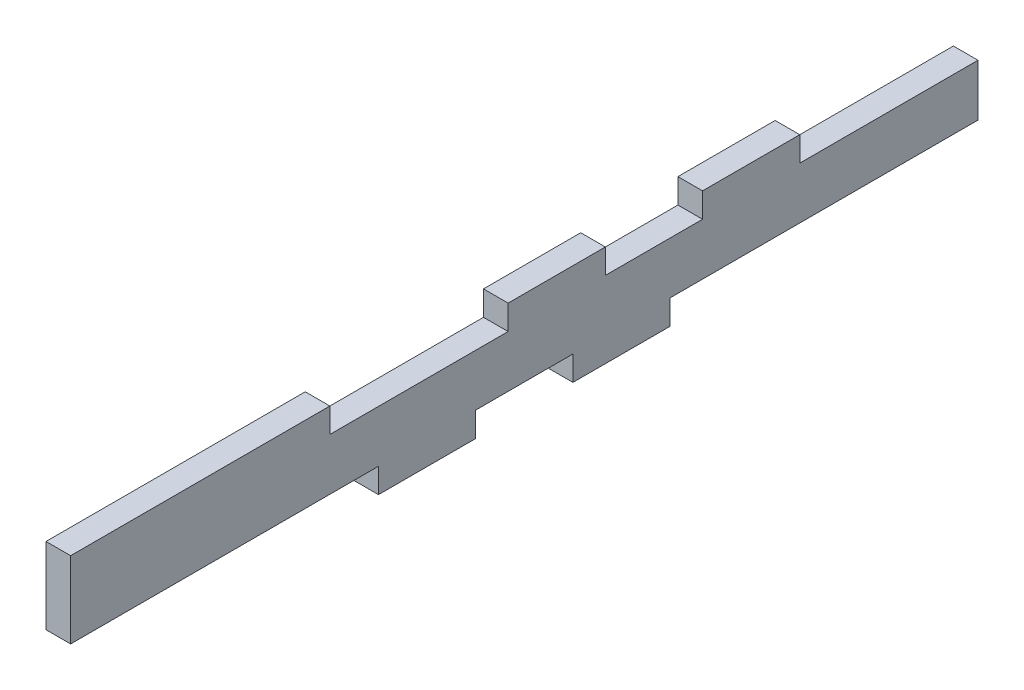
ISO-10303-21;
HEADER;
FILE_DESCRIPTION(('STEP AP214'),'2;1');
FILE_NAME('part.step','',(''),(''),'','','');
FILE_SCHEMA(('AUTOMOTIVE_DESIGN { 1 0 10303 214 1 1 1 1 }'));
ENDSEC;
DATA;
#1=APPLICATION_CONTEXT('core data for automotive mechanical design processes');
#2=APPLICATION_PROTOCOL_DEFINITION('international standard','automotive_design',2000,#1);
#3=PRODUCT_CONTEXT('',#1,'mechanical');
#4=PRODUCT('Part','Part','',(#3));
#5=PRODUCT_RELATED_PRODUCT_CATEGORY('part','',(#4));
#6=PRODUCT_DEFINITION_FORMATION('','',#4);
#7=PRODUCT_DEFINITION_CONTEXT('part definition',#1,'design');
#8=PRODUCT_DEFINITION('design','',#6,#7);
#9=PRODUCT_DEFINITION_SHAPE('','',#8);
#10=(LENGTH_UNIT() NAMED_UNIT(*) SI_UNIT(.MILLI.,.METRE.));
#11=(NAMED_UNIT(*) PLANE_ANGLE_UNIT() SI_UNIT($,.RADIAN.));
#12=(NAMED_UNIT(*) SI_UNIT($,.STERADIAN.) SOLID_ANGLE_UNIT());
#13=UNCERTAINTY_MEASURE_WITH_UNIT(LENGTH_MEASURE(1.E-05),#10,'distance_accuracy_value','');
#14=(GEOMETRIC_REPRESENTATION_CONTEXT(3) GLOBAL_UNCERTAINTY_ASSIGNED_CONTEXT((#13)) GLOBAL_UNIT_ASSIGNED_CONTEXT((#10,
#11,#12)) REPRESENTATION_CONTEXT('',''));
#15=CARTESIAN_POINT('',(0.,0.,0.));
#16=DIRECTION('',(0.,0.,1.));
#17=DIRECTION('',(1.,0.,0.));
#18=AXIS2_PLACEMENT_3D('',#15,#16,#17);
#19=CARTESIAN_POINT('',(4.826,0.,0.));
#20=DIRECTION('',(0.,1.,0.));
#21=DIRECTION('',(0.,0.,1.));
#22=AXIS2_PLACEMENT_3D('',#19,#20,#21);
#23=PLANE('',#22);
#24=DIRECTION('',(0.,0.,-1.));
#25=VECTOR('',#24,1.);
#26=CARTESIAN_POINT('',(4.826,0.,0.));
#27=LINE('',#26,#25);
#28=CARTESIAN_POINT('',(4.826,0.,-98.425));
#29=VERTEX_POINT('',#28);
#30=CARTESIAN_POINT('',(4.826,0.,-117.475));
#31=VERTEX_POINT('',#30);
#32=EDGE_CURVE('E328',#29,#31,#27,.T.);
#33=ORIENTED_EDGE('',*,*,#32,.F.);
#34=DIRECTION('',(1.,0.,0.));
#35=VECTOR('',#34,1.);
#36=CARTESIAN_POINT('',(0.,0.,-98.425));
#37=LINE('',#36,#35);
#38=CARTESIAN_POINT('',(0.,0.,-98.425));
#39=VERTEX_POINT('',#38);
#40=EDGE_CURVE('E210',#39,#29,#37,.T.);
#41=ORIENTED_EDGE('',*,*,#40,.F.);
#42=DIRECTION('',(0.,0.,-1.));
#43=VECTOR('',#42,1.);
#44=CARTESIAN_POINT('',(0.,0.,0.));
#45=LINE('',#44,#43);
#46=CARTESIAN_POINT('',(0.,0.,-117.475));
#47=VERTEX_POINT('',#46);
#48=EDGE_CURVE('E201',#39,#47,#45,.T.);
#49=ORIENTED_EDGE('',*,*,#48,.T.);
#50=DIRECTION('',(1.,0.,0.));
#51=VECTOR('',#50,1.);
#52=CARTESIAN_POINT('',(0.,0.,-117.475));
#53=LINE('',#52,#51);
#54=EDGE_CURVE('E227',#47,#31,#53,.T.);
#55=ORIENTED_EDGE('',*,*,#54,.T.);
#56=EDGE_LOOP('',(#33,#41,#49,#55));
#57=FACE_BOUND('',#56,.T.);
#58=ADVANCED_FACE('F32',(#57),#23,.F.);
#59=CARTESIAN_POINT('',(4.826,19.812,0.));
#60=DIRECTION('',(0.,-1.,0.));
#61=DIRECTION('',(0.,0.,-1.));
#62=AXIS2_PLACEMENT_3D('',#59,#60,#61);
#63=PLANE('',#62);
#64=DIRECTION('',(0.,0.,1.));
#65=VECTOR('',#64,1.);
#66=CARTESIAN_POINT('',(4.826,19.812,0.));
#67=LINE('',#66,#65);
#68=CARTESIAN_POINT('',(4.826,19.812,-104.775));
#69=VERTEX_POINT('',#68);
#70=CARTESIAN_POINT('',(4.826,19.812,-85.725));
#71=VERTEX_POINT('',#70);
#72=EDGE_CURVE('E337',#69,#71,#67,.T.);
#73=ORIENTED_EDGE('',*,*,#72,.F.);
#74=DIRECTION('',(1.,0.,0.));
#75=VECTOR('',#74,1.);
#76=CARTESIAN_POINT('',(0.,19.812,-104.775));
#77=LINE('',#76,#75);
#78=CARTESIAN_POINT('',(0.,19.812,-104.775));
#79=VERTEX_POINT('',#78);
#80=EDGE_CURVE('E289',#79,#69,#77,.T.);
#81=ORIENTED_EDGE('',*,*,#80,.F.);
#82=DIRECTION('',(0.,0.,1.));
#83=VECTOR('',#82,1.);
#84=CARTESIAN_POINT('',(0.,19.812,0.));
#85=LINE('',#84,#83);
#86=CARTESIAN_POINT('',(0.,19.812,-85.725));
#87=VERTEX_POINT('',#86);
#88=EDGE_CURVE('E345',#79,#87,#85,.T.);
#89=ORIENTED_EDGE('',*,*,#88,.T.);
#90=DIRECTION('',(1.,0.,0.));
#91=VECTOR('',#90,1.);
#92=CARTESIAN_POINT('',(0.,19.812,-85.725));
#93=LINE('',#92,#91);
#94=EDGE_CURVE('E319',#87,#71,#93,.T.);
#95=ORIENTED_EDGE('',*,*,#94,.T.);
#96=EDGE_LOOP('',(#73,#81,#89,#95));
#97=FACE_BOUND('',#96,.T.);
#98=ADVANCED_FACE('F383',(#97),#63,.F.);
#99=CARTESIAN_POINT('',(4.826,19.812,-50.8));
#100=VERTEX_POINT('',#99);
#101=CARTESIAN_POINT('',(4.826,19.812,0.));
#102=VERTEX_POINT('',#101);
#103=EDGE_CURVE('E335',#100,#102,#67,.T.);
#104=ORIENTED_EDGE('',*,*,#103,.F.);
#105=DIRECTION('',(1.,0.,0.));
#106=VECTOR('',#105,1.);
#107=CARTESIAN_POINT('',(0.,19.812,-50.8));
#108=LINE('',#107,#106);
#109=CARTESIAN_POINT('',(0.,19.812,-50.8));
#110=VERTEX_POINT('',#109);
#111=EDGE_CURVE('E316',#110,#100,#108,.T.);
#112=ORIENTED_EDGE('',*,*,#111,.F.);
#113=CARTESIAN_POINT('',(0.,19.812,0.));
#114=VERTEX_POINT('',#113);
#115=EDGE_CURVE('E344',#110,#114,#85,.T.);
#116=ORIENTED_EDGE('',*,*,#115,.T.);
#117=DIRECTION('',(-1.,0.,0.));
#118=VECTOR('',#117,1.);
#119=CARTESIAN_POINT('',(4.826,19.812,0.));
#120=LINE('',#119,#118);
#121=EDGE_CURVE('E11',#102,#114,#120,.T.);
#122=ORIENTED_EDGE('',*,*,#121,.F.);
#123=EDGE_LOOP('',(#104,#112,#116,#122));
#124=FACE_BOUND('',#123,.T.);
#125=ADVANCED_FACE('F355',(#124),#63,.F.);
#126=CARTESIAN_POINT('',(4.826,0.,0.));
#127=DIRECTION('',(0.,0.,-1.));
#128=DIRECTION('',(-1.,0.,0.));
#129=AXIS2_PLACEMENT_3D('',#126,#127,#128);
#130=PLANE('',#129);
#131=DIRECTION('',(0.,-1.,0.));
#132=VECTOR('',#131,1.);
#133=CARTESIAN_POINT('',(0.,0.,0.));
#134=LINE('',#133,#132);
#135=CARTESIAN_POINT('',(0.,4.826,0.));
#136=VERTEX_POINT('',#135);
#137=EDGE_CURVE('E318',#114,#136,#134,.T.);
#138=ORIENTED_EDGE('',*,*,#137,.T.);
#139=DIRECTION('',(1.,0.,0.));
#140=VECTOR('',#139,1.);
#141=CARTESIAN_POINT('',(0.,4.826,0.));
#142=LINE('',#141,#140);
#143=CARTESIAN_POINT('',(4.826,4.826,0.));
#144=VERTEX_POINT('',#143);
#145=EDGE_CURVE('E245',#136,#144,#142,.T.);
#146=ORIENTED_EDGE('',*,*,#145,.T.);
#147=DIRECTION('',(0.,-1.,0.));
#148=VECTOR('',#147,1.);
#149=CARTESIAN_POINT('',(4.826,0.,0.));
#150=LINE('',#149,#148);
#151=EDGE_CURVE('E325',#102,#144,#150,.T.);
#152=ORIENTED_EDGE('',*,*,#151,.F.);
#153=ORIENTED_EDGE('',*,*,#121,.T.);
#154=EDGE_LOOP('',(#138,#146,#152,#153));
#155=FACE_BOUND('',#154,.T.);
#156=ADVANCED_FACE('F34',(#155),#130,.F.);
#157=CARTESIAN_POINT('',(0.,0.,-60.325));
#158=VERTEX_POINT('',#157);
#159=CARTESIAN_POINT('',(0.,0.,-79.375));
#160=VERTEX_POINT('',#159);
#161=EDGE_CURVE('E340',#158,#160,#45,.T.);
#162=ORIENTED_EDGE('',*,*,#161,.T.);
#163=DIRECTION('',(1.,0.,0.));
#164=VECTOR('',#163,1.);
#165=CARTESIAN_POINT('',(0.,0.,-79.375));
#166=LINE('',#165,#164);
#167=CARTESIAN_POINT('',(4.826,0.,-79.375));
#168=VERTEX_POINT('',#167);
#169=EDGE_CURVE('E213',#160,#168,#166,.T.);
#170=ORIENTED_EDGE('',*,*,#169,.T.);
#171=CARTESIAN_POINT('',(4.826,0.,-60.325));
#172=VERTEX_POINT('',#171);
#173=EDGE_CURVE('E330',#172,#168,#27,.T.);
#174=ORIENTED_EDGE('',*,*,#173,.F.);
#175=DIRECTION('',(1.,0.,0.));
#176=VECTOR('',#175,1.);
#177=CARTESIAN_POINT('',(0.,0.,-60.325));
#178=LINE('',#177,#176);
#179=EDGE_CURVE('E241',#158,#172,#178,.T.);
#180=ORIENTED_EDGE('',*,*,#179,.F.);
#181=EDGE_LOOP('',(#162,#170,#174,#180));
#182=FACE_BOUND('',#181,.T.);
#183=ADVANCED_FACE('F403',(#182),#23,.F.);
#184=CARTESIAN_POINT('',(4.826,0.,-177.8));
#185=DIRECTION('',(0.,0.,1.));
#186=DIRECTION('',(1.,0.,0.));
#187=AXIS2_PLACEMENT_3D('',#184,#185,#186);
#188=PLANE('',#187);
#189=DIRECTION('',(0.,1.,0.));
#190=VECTOR('',#189,1.);
#191=CARTESIAN_POINT('',(4.826,0.,-177.8));
#192=LINE('',#191,#190);
#193=CARTESIAN_POINT('',(4.826,4.826,-177.8));
#194=VERTEX_POINT('',#193);
#195=CARTESIAN_POINT('',(4.826,14.986,-177.8));
#196=VERTEX_POINT('',#195);
#197=EDGE_CURVE('E333',#194,#196,#192,.T.);
#198=ORIENTED_EDGE('',*,*,#197,.F.);
#199=DIRECTION('',(1.,0.,0.));
#200=VECTOR('',#199,1.);
#201=CARTESIAN_POINT('',(0.,4.826,-177.8));
#202=LINE('',#201,#200);
#203=CARTESIAN_POINT('',(0.,4.826,-177.8));
#204=VERTEX_POINT('',#203);
#205=EDGE_CURVE('E222',#204,#194,#202,.T.);
#206=ORIENTED_EDGE('',*,*,#205,.F.);
#207=DIRECTION('',(0.,1.,0.));
#208=VECTOR('',#207,1.);
#209=CARTESIAN_POINT('',(0.,0.,-177.8));
#210=LINE('',#209,#208);
#211=CARTESIAN_POINT('',(0.,14.986,-177.8));
#212=VERTEX_POINT('',#211);
#213=EDGE_CURVE('E343',#204,#212,#210,.T.);
#214=ORIENTED_EDGE('',*,*,#213,.T.);
#215=DIRECTION('',(1.,0.,0.));
#216=VECTOR('',#215,1.);
#217=CARTESIAN_POINT('',(0.,14.986,-177.8));
#218=LINE('',#217,#216);
#219=EDGE_CURVE('E264',#212,#196,#218,.T.);
#220=ORIENTED_EDGE('',*,*,#219,.T.);
#221=EDGE_LOOP('',(#198,#206,#214,#220));
#222=FACE_BOUND('',#221,.T.);
#223=ADVANCED_FACE('F414',(#222),#188,.F.);
#224=CARTESIAN_POINT('',(4.826,19.812,-142.875));
#225=VERTEX_POINT('',#224);
#226=CARTESIAN_POINT('',(4.826,19.812,-123.825));
#227=VERTEX_POINT('',#226);
#228=EDGE_CURVE('E40',#225,#227,#67,.T.);
#229=ORIENTED_EDGE('',*,*,#228,.F.);
#230=DIRECTION('',(1.,0.,0.));
#231=VECTOR('',#230,1.);
#232=CARTESIAN_POINT('',(0.,19.812,-142.875));
#233=LINE('',#232,#231);
#234=CARTESIAN_POINT('',(0.,19.812,-142.875));
#235=VERTEX_POINT('',#234);
#236=EDGE_CURVE('E259',#235,#225,#233,.T.);
#237=ORIENTED_EDGE('',*,*,#236,.F.);
#238=CARTESIAN_POINT('',(0.,19.812,-123.825));
#239=VERTEX_POINT('',#238);
#240=EDGE_CURVE('E329',#235,#239,#85,.T.);
#241=ORIENTED_EDGE('',*,*,#240,.T.);
#242=DIRECTION('',(1.,0.,0.));
#243=VECTOR('',#242,1.);
#244=CARTESIAN_POINT('',(0.,19.812,-123.825));
#245=LINE('',#244,#243);
#246=EDGE_CURVE('E292',#239,#227,#245,.T.);
#247=ORIENTED_EDGE('',*,*,#246,.T.);
#248=EDGE_LOOP('',(#229,#237,#241,#247));
#249=FACE_BOUND('',#248,.T.);
#250=ADVANCED_FACE('F410',(#249),#63,.F.);
#251=CARTESIAN_POINT('',(4.826,0.,0.));
#252=DIRECTION('',(-1.,0.,0.));
#253=DIRECTION('',(0.,0.,1.));
#254=AXIS2_PLACEMENT_3D('',#251,#252,#253);
#255=PLANE('',#254);
#256=DIRECTION('',(0.,0.,1.));
#257=VECTOR('',#256,1.);
#258=CARTESIAN_POINT('',(4.826,4.826,-98.425));
#259=LINE('',#258,#257);
#260=CARTESIAN_POINT('',(4.826,4.826,-98.425));
#261=VERTEX_POINT('',#260);
#262=CARTESIAN_POINT('',(4.826,4.826,-79.375));
#263=VERTEX_POINT('',#262);
#264=EDGE_CURVE('E204',#261,#263,#259,.T.);
#265=ORIENTED_EDGE('',*,*,#264,.F.);
#266=DIRECTION('',(0.,1.,0.));
#267=VECTOR('',#266,1.);
#268=CARTESIAN_POINT('',(4.826,0.,-98.425));
#269=LINE('',#268,#267);
#270=EDGE_CURVE('E188',#29,#261,#269,.T.);
#271=ORIENTED_EDGE('',*,*,#270,.F.);
#272=ORIENTED_EDGE('',*,*,#32,.T.);
#273=DIRECTION('',(0.,-1.,0.));
#274=VECTOR('',#273,1.);
#275=CARTESIAN_POINT('',(4.826,0.,-117.475));
#276=LINE('',#275,#274);
#277=CARTESIAN_POINT('',(4.826,4.826,-117.475));
#278=VERTEX_POINT('',#277);
#279=EDGE_CURVE('E220',#278,#31,#276,.T.);
#280=ORIENTED_EDGE('',*,*,#279,.F.);
#281=DIRECTION('',(0.,0.,1.));
#282=VECTOR('',#281,1.);
#283=CARTESIAN_POINT('',(4.826,4.826,-177.8));
#284=LINE('',#283,#282);
#285=EDGE_CURVE('E212',#194,#278,#284,.T.);
#286=ORIENTED_EDGE('',*,*,#285,.F.);
#287=ORIENTED_EDGE('',*,*,#197,.T.);
#288=DIRECTION('',(0.,0.,-1.));
#289=VECTOR('',#288,1.);
#290=CARTESIAN_POINT('',(4.826,14.986,-177.8));
#291=LINE('',#290,#289);
#292=CARTESIAN_POINT('',(4.826,14.986,-142.875));
#293=VERTEX_POINT('',#292);
#294=EDGE_CURVE('E256',#293,#196,#291,.T.);
#295=ORIENTED_EDGE('',*,*,#294,.F.);
#296=DIRECTION('',(0.,-1.,0.));
#297=VECTOR('',#296,1.);
#298=CARTESIAN_POINT('',(4.826,19.812,-142.875));
#299=LINE('',#298,#297);
#300=EDGE_CURVE('E248',#225,#293,#299,.T.);
#301=ORIENTED_EDGE('',*,*,#300,.F.);
#302=ORIENTED_EDGE('',*,*,#228,.T.);
#303=DIRECTION('',(0.,1.,0.));
#304=VECTOR('',#303,1.);
#305=CARTESIAN_POINT('',(4.826,19.812,-123.825));
#306=LINE('',#305,#304);
#307=CARTESIAN_POINT('',(4.826,14.986,-123.825));
#308=VERTEX_POINT('',#307);
#309=EDGE_CURVE('E275',#308,#227,#306,.T.);
#310=ORIENTED_EDGE('',*,*,#309,.F.);
#311=DIRECTION('',(0.,0.,-1.));
#312=VECTOR('',#311,1.);
#313=CARTESIAN_POINT('',(4.826,14.986,-104.775));
#314=LINE('',#313,#312);
#315=CARTESIAN_POINT('',(4.826,14.986,-104.775));
#316=VERTEX_POINT('',#315);
#317=EDGE_CURVE('E284',#316,#308,#314,.T.);
#318=ORIENTED_EDGE('',*,*,#317,.F.);
#319=DIRECTION('',(0.,-1.,0.));
#320=VECTOR('',#319,1.);
#321=CARTESIAN_POINT('',(4.826,19.812,-104.775));
#322=LINE('',#321,#320);
#323=EDGE_CURVE('E267',#69,#316,#322,.T.);
#324=ORIENTED_EDGE('',*,*,#323,.F.);
#325=ORIENTED_EDGE('',*,*,#72,.T.);
#326=DIRECTION('',(0.,1.,0.));
#327=VECTOR('',#326,1.);
#328=CARTESIAN_POINT('',(4.826,19.812,-85.725));
#329=LINE('',#328,#327);
#330=CARTESIAN_POINT('',(4.826,14.986,-85.725));
#331=VERTEX_POINT('',#330);
#332=EDGE_CURVE('E302',#331,#71,#329,.T.);
#333=ORIENTED_EDGE('',*,*,#332,.F.);
#334=DIRECTION('',(0.,0.,-1.));
#335=VECTOR('',#334,1.);
#336=CARTESIAN_POINT('',(4.826,14.986,-50.8));
#337=LINE('',#336,#335);
#338=CARTESIAN_POINT('',(4.826,14.986,-50.8));
#339=VERTEX_POINT('',#338);
#340=EDGE_CURVE('E311',#339,#331,#337,.T.);
#341=ORIENTED_EDGE('',*,*,#340,.F.);
#342=DIRECTION('',(0.,-1.,0.));
#343=VECTOR('',#342,1.);
#344=CARTESIAN_POINT('',(4.826,19.812,-50.8));
#345=LINE('',#344,#343);
#346=EDGE_CURVE('E291',#100,#339,#345,.T.);
#347=ORIENTED_EDGE('',*,*,#346,.F.);
#348=ORIENTED_EDGE('',*,*,#103,.T.);
#349=ORIENTED_EDGE('',*,*,#151,.T.);
#350=DIRECTION('',(0.,0.,1.));
#351=VECTOR('',#350,1.);
#352=CARTESIAN_POINT('',(4.826,4.826,0.));
#353=LINE('',#352,#351);
#354=CARTESIAN_POINT('',(4.826,4.826,-60.325));
#355=VERTEX_POINT('',#354);
#356=EDGE_CURVE('E238',#355,#144,#353,.T.);
#357=ORIENTED_EDGE('',*,*,#356,.F.);
#358=DIRECTION('',(0.,1.,0.));
#359=VECTOR('',#358,1.);
#360=CARTESIAN_POINT('',(4.826,0.,-60.325));
#361=LINE('',#360,#359);
#362=EDGE_CURVE('E230',#172,#355,#361,.T.);
#363=ORIENTED_EDGE('',*,*,#362,.F.);
#364=ORIENTED_EDGE('',*,*,#173,.T.);
#365=DIRECTION('',(0.,-1.,0.));
#366=VECTOR('',#365,1.);
#367=CARTESIAN_POINT('',(4.826,0.,-79.375));
#368=LINE('',#367,#366);
#369=EDGE_CURVE('E202',#263,#168,#368,.T.);
#370=ORIENTED_EDGE('',*,*,#369,.F.);
#371=EDGE_LOOP('',(#265,#271,#272,#280,#286,#287,#295,#301,#302,#310,#318,#324,#325,#333,#341,
#347,#348,#349,#357,#363,#364,#370));
#372=FACE_BOUND('',#371,.T.);
#373=ADVANCED_FACE('F370',(#372),#255,.F.);
#374=CARTESIAN_POINT('',(0.,0.,0.));
#375=DIRECTION('',(-1.,0.,0.));
#376=DIRECTION('',(0.,0.,1.));
#377=AXIS2_PLACEMENT_3D('',#374,#375,#376);
#378=PLANE('',#377);
#379=DIRECTION('',(0.,1.,0.));
#380=VECTOR('',#379,1.);
#381=CARTESIAN_POINT('',(0.,0.,-98.425));
#382=LINE('',#381,#380);
#383=CARTESIAN_POINT('',(0.,4.826,-98.425));
#384=VERTEX_POINT('',#383);
#385=EDGE_CURVE('E185',#39,#384,#382,.T.);
#386=ORIENTED_EDGE('',*,*,#385,.T.);
#387=DIRECTION('',(0.,0.,1.));
#388=VECTOR('',#387,1.);
#389=CARTESIAN_POINT('',(0.,4.826,-98.425));
#390=LINE('',#389,#388);
#391=CARTESIAN_POINT('',(0.,4.826,-79.375));
#392=VERTEX_POINT('',#391);
#393=EDGE_CURVE('E195',#384,#392,#390,.T.);
#394=ORIENTED_EDGE('',*,*,#393,.T.);
#395=DIRECTION('',(0.,-1.,0.));
#396=VECTOR('',#395,1.);
#397=CARTESIAN_POINT('',(0.,0.,-79.375));
#398=LINE('',#397,#396);
#399=EDGE_CURVE('E47',#392,#160,#398,.T.);
#400=ORIENTED_EDGE('',*,*,#399,.T.);
#401=ORIENTED_EDGE('',*,*,#161,.F.);
#402=DIRECTION('',(0.,1.,0.));
#403=VECTOR('',#402,1.);
#404=CARTESIAN_POINT('',(0.,0.,-60.325));
#405=LINE('',#404,#403);
#406=CARTESIAN_POINT('',(0.,4.826,-60.325));
#407=VERTEX_POINT('',#406);
#408=EDGE_CURVE('E234',#158,#407,#405,.T.);
#409=ORIENTED_EDGE('',*,*,#408,.T.);
#410=DIRECTION('',(0.,0.,1.));
#411=VECTOR('',#410,1.);
#412=CARTESIAN_POINT('',(0.,4.826,0.));
#413=LINE('',#412,#411);
#414=EDGE_CURVE('E237',#407,#136,#413,.T.);
#415=ORIENTED_EDGE('',*,*,#414,.T.);
#416=ORIENTED_EDGE('',*,*,#137,.F.);
#417=ORIENTED_EDGE('',*,*,#115,.F.);
#418=DIRECTION('',(0.,-1.,0.));
#419=VECTOR('',#418,1.);
#420=CARTESIAN_POINT('',(0.,19.812,-50.8));
#421=LINE('',#420,#419);
#422=CARTESIAN_POINT('',(0.,14.986,-50.8));
#423=VERTEX_POINT('',#422);
#424=EDGE_CURVE('E298',#110,#423,#421,.T.);
#425=ORIENTED_EDGE('',*,*,#424,.T.);
#426=DIRECTION('',(0.,0.,-1.));
#427=VECTOR('',#426,1.);
#428=CARTESIAN_POINT('',(0.,14.986,-50.8));
#429=LINE('',#428,#427);
#430=CARTESIAN_POINT('',(0.,14.986,-85.725));
#431=VERTEX_POINT('',#430);
#432=EDGE_CURVE('E301',#423,#431,#429,.T.);
#433=ORIENTED_EDGE('',*,*,#432,.T.);
#434=DIRECTION('',(0.,1.,0.));
#435=VECTOR('',#434,1.);
#436=CARTESIAN_POINT('',(0.,19.812,-85.725));
#437=LINE('',#436,#435);
#438=EDGE_CURVE('E305',#431,#87,#437,.T.);
#439=ORIENTED_EDGE('',*,*,#438,.T.);
#440=ORIENTED_EDGE('',*,*,#88,.F.);
#441=DIRECTION('',(0.,-1.,0.));
#442=VECTOR('',#441,1.);
#443=CARTESIAN_POINT('',(0.,19.812,-104.775));
#444=LINE('',#443,#442);
#445=CARTESIAN_POINT('',(0.,14.986,-104.775));
#446=VERTEX_POINT('',#445);
#447=EDGE_CURVE('E271',#79,#446,#444,.T.);
#448=ORIENTED_EDGE('',*,*,#447,.T.);
#449=DIRECTION('',(0.,0.,-1.));
#450=VECTOR('',#449,1.);
#451=CARTESIAN_POINT('',(0.,14.986,-104.775));
#452=LINE('',#451,#450);
#453=CARTESIAN_POINT('',(0.,14.986,-123.825));
#454=VERTEX_POINT('',#453);
#455=EDGE_CURVE('E274',#446,#454,#452,.T.);
#456=ORIENTED_EDGE('',*,*,#455,.T.);
#457=DIRECTION('',(0.,1.,0.));
#458=VECTOR('',#457,1.);
#459=CARTESIAN_POINT('',(0.,19.812,-123.825));
#460=LINE('',#459,#458);
#461=EDGE_CURVE('E278',#454,#239,#460,.T.);
#462=ORIENTED_EDGE('',*,*,#461,.T.);
#463=ORIENTED_EDGE('',*,*,#240,.F.);
#464=DIRECTION('',(0.,-1.,0.));
#465=VECTOR('',#464,1.);
#466=CARTESIAN_POINT('',(0.,19.812,-142.875));
#467=LINE('',#466,#465);
#468=CARTESIAN_POINT('',(0.,14.986,-142.875));
#469=VERTEX_POINT('',#468);
#470=EDGE_CURVE('E252',#235,#469,#467,.T.);
#471=ORIENTED_EDGE('',*,*,#470,.T.);
#472=DIRECTION('',(0.,0.,-1.));
#473=VECTOR('',#472,1.);
#474=CARTESIAN_POINT('',(0.,14.986,-177.8));
#475=LINE('',#474,#473);
#476=EDGE_CURVE('E255',#469,#212,#475,.T.);
#477=ORIENTED_EDGE('',*,*,#476,.T.);
#478=ORIENTED_EDGE('',*,*,#213,.F.);
#479=DIRECTION('',(0.,0.,1.));
#480=VECTOR('',#479,1.);
#481=CARTESIAN_POINT('',(0.,4.826,-177.8));
#482=LINE('',#481,#480);
#483=CARTESIAN_POINT('',(0.,4.826,-117.475));
#484=VERTEX_POINT('',#483);
#485=EDGE_CURVE('E217',#204,#484,#482,.T.);
#486=ORIENTED_EDGE('',*,*,#485,.T.);
#487=DIRECTION('',(0.,-1.,0.));
#488=VECTOR('',#487,1.);
#489=CARTESIAN_POINT('',(0.,0.,-117.475));
#490=LINE('',#489,#488);
#491=EDGE_CURVE('E55',#484,#47,#490,.T.);
#492=ORIENTED_EDGE('',*,*,#491,.T.);
#493=ORIENTED_EDGE('',*,*,#48,.F.);
#494=EDGE_LOOP('',(#386,#394,#400,#401,#409,#415,#416,#417,#425,#433,#439,#440,#448,#456,#462,
#463,#471,#477,#478,#486,#492,#493));
#495=FACE_BOUND('',#494,.T.);
#496=ADVANCED_FACE('F200',(#495),#378,.T.);
#497=CARTESIAN_POINT('',(0.,19.812,-50.8));
#498=DIRECTION('',(0.,0.,1.));
#499=DIRECTION('',(0.,-1.,0.));
#500=AXIS2_PLACEMENT_3D('',#497,#498,#499);
#501=PLANE('',#500);
#502=ORIENTED_EDGE('',*,*,#346,.T.);
#503=DIRECTION('',(1.,0.,0.));
#504=VECTOR('',#503,1.);
#505=CARTESIAN_POINT('',(0.,14.986,-50.8));
#506=LINE('',#505,#504);
#507=EDGE_CURVE('E308',#423,#339,#506,.T.);
#508=ORIENTED_EDGE('',*,*,#507,.F.);
#509=ORIENTED_EDGE('',*,*,#424,.F.);
#510=ORIENTED_EDGE('',*,*,#111,.T.);
#511=EDGE_LOOP('',(#502,#508,#509,#510));
#512=FACE_BOUND('',#511,.T.);
#513=ADVANCED_FACE('F389',(#512),#501,.F.);
#514=CARTESIAN_POINT('',(0.,19.812,-85.725));
#515=DIRECTION('',(0.,0.,-1.));
#516=DIRECTION('',(-1.,0.,0.));
#517=AXIS2_PLACEMENT_3D('',#514,#515,#516);
#518=PLANE('',#517);
#519=ORIENTED_EDGE('',*,*,#332,.T.);
#520=ORIENTED_EDGE('',*,*,#94,.F.);
#521=ORIENTED_EDGE('',*,*,#438,.F.);
#522=DIRECTION('',(1.,0.,0.));
#523=VECTOR('',#522,1.);
#524=CARTESIAN_POINT('',(0.,14.986,-85.725));
#525=LINE('',#524,#523);
#526=EDGE_CURVE('E322',#431,#331,#525,.T.);
#527=ORIENTED_EDGE('',*,*,#526,.T.);
#528=EDGE_LOOP('',(#519,#520,#521,#527));
#529=FACE_BOUND('',#528,.T.);
#530=ADVANCED_FACE('F381',(#529),#518,.F.);
#531=CARTESIAN_POINT('',(0.,14.986,-50.8));
#532=DIRECTION('',(0.,-1.,0.));
#533=DIRECTION('',(0.,0.,-1.));
#534=AXIS2_PLACEMENT_3D('',#531,#532,#533);
#535=PLANE('',#534);
#536=ORIENTED_EDGE('',*,*,#340,.T.);
#537=ORIENTED_EDGE('',*,*,#526,.F.);
#538=ORIENTED_EDGE('',*,*,#432,.F.);
#539=ORIENTED_EDGE('',*,*,#507,.T.);
#540=EDGE_LOOP('',(#536,#537,#538,#539));
#541=FACE_BOUND('',#540,.T.);
#542=ADVANCED_FACE('F387',(#541),#535,.F.);
#543=CARTESIAN_POINT('',(0.,19.812,-104.775));
#544=DIRECTION('',(0.,0.,1.));
#545=DIRECTION('',(1.,0.,0.));
#546=AXIS2_PLACEMENT_3D('',#543,#544,#545);
#547=PLANE('',#546);
#548=ORIENTED_EDGE('',*,*,#323,.T.);
#549=DIRECTION('',(1.,0.,0.));
#550=VECTOR('',#549,1.);
#551=CARTESIAN_POINT('',(0.,14.986,-104.775));
#552=LINE('',#551,#550);
#553=EDGE_CURVE('E281',#446,#316,#552,.T.);
#554=ORIENTED_EDGE('',*,*,#553,.F.);
#555=ORIENTED_EDGE('',*,*,#447,.F.);
#556=ORIENTED_EDGE('',*,*,#80,.T.);
#557=EDGE_LOOP('',(#548,#554,#555,#556));
#558=FACE_BOUND('',#557,.T.);
#559=ADVANCED_FACE('F454',(#558),#547,.F.);
#560=CARTESIAN_POINT('',(0.,19.812,-123.825));
#561=DIRECTION('',(0.,0.,-1.));
#562=DIRECTION('',(-1.,0.,0.));
#563=AXIS2_PLACEMENT_3D('',#560,#561,#562);
#564=PLANE('',#563);
#565=ORIENTED_EDGE('',*,*,#309,.T.);
#566=ORIENTED_EDGE('',*,*,#246,.F.);
#567=ORIENTED_EDGE('',*,*,#461,.F.);
#568=DIRECTION('',(1.,0.,0.));
#569=VECTOR('',#568,1.);
#570=CARTESIAN_POINT('',(0.,14.986,-123.825));
#571=LINE('',#570,#569);
#572=EDGE_CURVE('E295',#454,#308,#571,.T.);
#573=ORIENTED_EDGE('',*,*,#572,.T.);
#574=EDGE_LOOP('',(#565,#566,#567,#573));
#575=FACE_BOUND('',#574,.T.);
#576=ADVANCED_FACE('F451',(#575),#564,.F.);
#577=CARTESIAN_POINT('',(0.,14.986,-104.775));
#578=DIRECTION('',(0.,-1.,0.));
#579=DIRECTION('',(0.,0.,-1.));
#580=AXIS2_PLACEMENT_3D('',#577,#578,#579);
#581=PLANE('',#580);
#582=ORIENTED_EDGE('',*,*,#317,.T.);
#583=ORIENTED_EDGE('',*,*,#572,.F.);
#584=ORIENTED_EDGE('',*,*,#455,.F.);
#585=ORIENTED_EDGE('',*,*,#553,.T.);
#586=EDGE_LOOP('',(#582,#583,#584,#585));
#587=FACE_BOUND('',#586,.T.);
#588=ADVANCED_FACE('F446',(#587),#581,.F.);
#589=CARTESIAN_POINT('',(0.,14.986,-177.8));
#590=DIRECTION('',(0.,-1.,0.));
#591=DIRECTION('',(0.,0.,-1.));
#592=AXIS2_PLACEMENT_3D('',#589,#590,#591);
#593=PLANE('',#592);
#594=ORIENTED_EDGE('',*,*,#294,.T.);
#595=ORIENTED_EDGE('',*,*,#219,.F.);
#596=ORIENTED_EDGE('',*,*,#476,.F.);
#597=DIRECTION('',(1.,0.,0.));
#598=VECTOR('',#597,1.);
#599=CARTESIAN_POINT('',(0.,14.986,-142.875));
#600=LINE('',#599,#598);
#601=EDGE_CURVE('E268',#469,#293,#600,.T.);
#602=ORIENTED_EDGE('',*,*,#601,.T.);
#603=EDGE_LOOP('',(#594,#595,#596,#602));
#604=FACE_BOUND('',#603,.T.);
#605=ADVANCED_FACE('F443',(#604),#593,.F.);
#606=CARTESIAN_POINT('',(0.,19.812,-142.875));
#607=DIRECTION('',(0.,0.,1.));
#608=DIRECTION('',(1.,0.,0.));
#609=AXIS2_PLACEMENT_3D('',#606,#607,#608);
#610=PLANE('',#609);
#611=ORIENTED_EDGE('',*,*,#300,.T.);
#612=ORIENTED_EDGE('',*,*,#601,.F.);
#613=ORIENTED_EDGE('',*,*,#470,.F.);
#614=ORIENTED_EDGE('',*,*,#236,.T.);
#615=EDGE_LOOP('',(#611,#612,#613,#614));
#616=FACE_BOUND('',#615,.T.);
#617=ADVANCED_FACE('F440',(#616),#610,.F.);
#618=CARTESIAN_POINT('',(0.,4.826,0.));
#619=DIRECTION('',(0.,1.,0.));
#620=DIRECTION('',(0.,0.,1.));
#621=AXIS2_PLACEMENT_3D('',#618,#619,#620);
#622=PLANE('',#621);
#623=ORIENTED_EDGE('',*,*,#356,.T.);
#624=ORIENTED_EDGE('',*,*,#145,.F.);
#625=ORIENTED_EDGE('',*,*,#414,.F.);
#626=DIRECTION('',(1.,0.,0.));
#627=VECTOR('',#626,1.);
#628=CARTESIAN_POINT('',(0.,4.826,-60.325));
#629=LINE('',#628,#627);
#630=EDGE_CURVE('E249',#407,#355,#629,.T.);
#631=ORIENTED_EDGE('',*,*,#630,.T.);
#632=EDGE_LOOP('',(#623,#624,#625,#631));
#633=FACE_BOUND('',#632,.T.);
#634=ADVANCED_FACE('F362',(#633),#622,.F.);
#635=CARTESIAN_POINT('',(0.,0.,-60.325));
#636=DIRECTION('',(0.,0.,-1.));
#637=DIRECTION('',(-1.,0.,0.));
#638=AXIS2_PLACEMENT_3D('',#635,#636,#637);
#639=PLANE('',#638);
#640=ORIENTED_EDGE('',*,*,#362,.T.);
#641=ORIENTED_EDGE('',*,*,#630,.F.);
#642=ORIENTED_EDGE('',*,*,#408,.F.);
#643=ORIENTED_EDGE('',*,*,#179,.T.);
#644=EDGE_LOOP('',(#640,#641,#642,#643));
#645=FACE_BOUND('',#644,.T.);
#646=ADVANCED_FACE('F364',(#645),#639,.F.);
#647=CARTESIAN_POINT('',(0.,0.,-117.475));
#648=DIRECTION('',(0.,0.,1.));
#649=DIRECTION('',(1.,0.,0.));
#650=AXIS2_PLACEMENT_3D('',#647,#648,#649);
#651=PLANE('',#650);
#652=ORIENTED_EDGE('',*,*,#279,.T.);
#653=ORIENTED_EDGE('',*,*,#54,.F.);
#654=ORIENTED_EDGE('',*,*,#491,.F.);
#655=DIRECTION('',(1.,0.,0.));
#656=VECTOR('',#655,1.);
#657=CARTESIAN_POINT('',(0.,4.826,-117.475));
#658=LINE('',#657,#656);
#659=EDGE_CURVE('E231',#484,#278,#658,.T.);
#660=ORIENTED_EDGE('',*,*,#659,.T.);
#661=EDGE_LOOP('',(#652,#653,#654,#660));
#662=FACE_BOUND('',#661,.T.);
#663=ADVANCED_FACE('F432',(#662),#651,.F.);
#664=CARTESIAN_POINT('',(0.,4.826,-177.8));
#665=DIRECTION('',(0.,1.,0.));
#666=DIRECTION('',(0.,0.,1.));
#667=AXIS2_PLACEMENT_3D('',#664,#665,#666);
#668=PLANE('',#667);
#669=ORIENTED_EDGE('',*,*,#285,.T.);
#670=ORIENTED_EDGE('',*,*,#659,.F.);
#671=ORIENTED_EDGE('',*,*,#485,.F.);
#672=ORIENTED_EDGE('',*,*,#205,.T.);
#673=EDGE_LOOP('',(#669,#670,#671,#672));
#674=FACE_BOUND('',#673,.T.);
#675=ADVANCED_FACE('F429',(#674),#668,.F.);
#676=CARTESIAN_POINT('',(0.,0.,-98.425));
#677=DIRECTION('',(0.,0.,-1.));
#678=DIRECTION('',(0.,1.,0.));
#679=AXIS2_PLACEMENT_3D('',#676,#677,#678);
#680=PLANE('',#679);
#681=ORIENTED_EDGE('',*,*,#270,.T.);
#682=DIRECTION('',(1.,0.,0.));
#683=VECTOR('',#682,1.);
#684=CARTESIAN_POINT('',(0.,4.826,-98.425));
#685=LINE('',#684,#683);
#686=EDGE_CURVE('E181',#384,#261,#685,.T.);
#687=ORIENTED_EDGE('',*,*,#686,.F.);
#688=ORIENTED_EDGE('',*,*,#385,.F.);
#689=ORIENTED_EDGE('',*,*,#40,.T.);
#690=EDGE_LOOP('',(#681,#687,#688,#689));
#691=FACE_BOUND('',#690,.T.);
#692=ADVANCED_FACE('F183',(#691),#680,.F.);
#693=CARTESIAN_POINT('',(0.,0.,-79.375));
#694=DIRECTION('',(0.,0.,1.));
#695=DIRECTION('',(1.,0.,0.));
#696=AXIS2_PLACEMENT_3D('',#693,#694,#695);
#697=PLANE('',#696);
#698=ORIENTED_EDGE('',*,*,#369,.T.);
#699=ORIENTED_EDGE('',*,*,#169,.F.);
#700=ORIENTED_EDGE('',*,*,#399,.F.);
#701=DIRECTION('',(1.,0.,0.));
#702=VECTOR('',#701,1.);
#703=CARTESIAN_POINT('',(0.,4.826,-79.375));
#704=LINE('',#703,#702);
#705=EDGE_CURVE('E192',#392,#263,#704,.T.);
#706=ORIENTED_EDGE('',*,*,#705,.T.);
#707=EDGE_LOOP('',(#698,#699,#700,#706));
#708=FACE_BOUND('',#707,.T.);
#709=ADVANCED_FACE('F421',(#708),#697,.F.);
#710=CARTESIAN_POINT('',(0.,4.826,-98.425));
#711=DIRECTION('',(0.,1.,0.));
#712=DIRECTION('',(0.,0.,1.));
#713=AXIS2_PLACEMENT_3D('',#710,#711,#712);
#714=PLANE('',#713);
#715=ORIENTED_EDGE('',*,*,#264,.T.);
#716=ORIENTED_EDGE('',*,*,#705,.F.);
#717=ORIENTED_EDGE('',*,*,#393,.F.);
#718=ORIENTED_EDGE('',*,*,#686,.T.);
#719=EDGE_LOOP('',(#715,#716,#717,#718));
#720=FACE_BOUND('',#719,.T.);
#721=ADVANCED_FACE('F196',(#720),#714,.F.);
#722=CLOSED_SHELL('',(#58,#98,#125,#156,#183,#223,#250,#373,#496,#513,#530,#542,#559,#576,#588,
#605,#617,#634,#646,#663,#675,#692,#709,#721));
#723=MANIFOLD_SOLID_BREP('B2',#722);
#724=ADVANCED_BREP_SHAPE_REPRESENTATION('',(#18,#723),#14);
#725=SHAPE_DEFINITION_REPRESENTATION(#9,#724);
ENDSEC;
END-ISO-10303-21;
